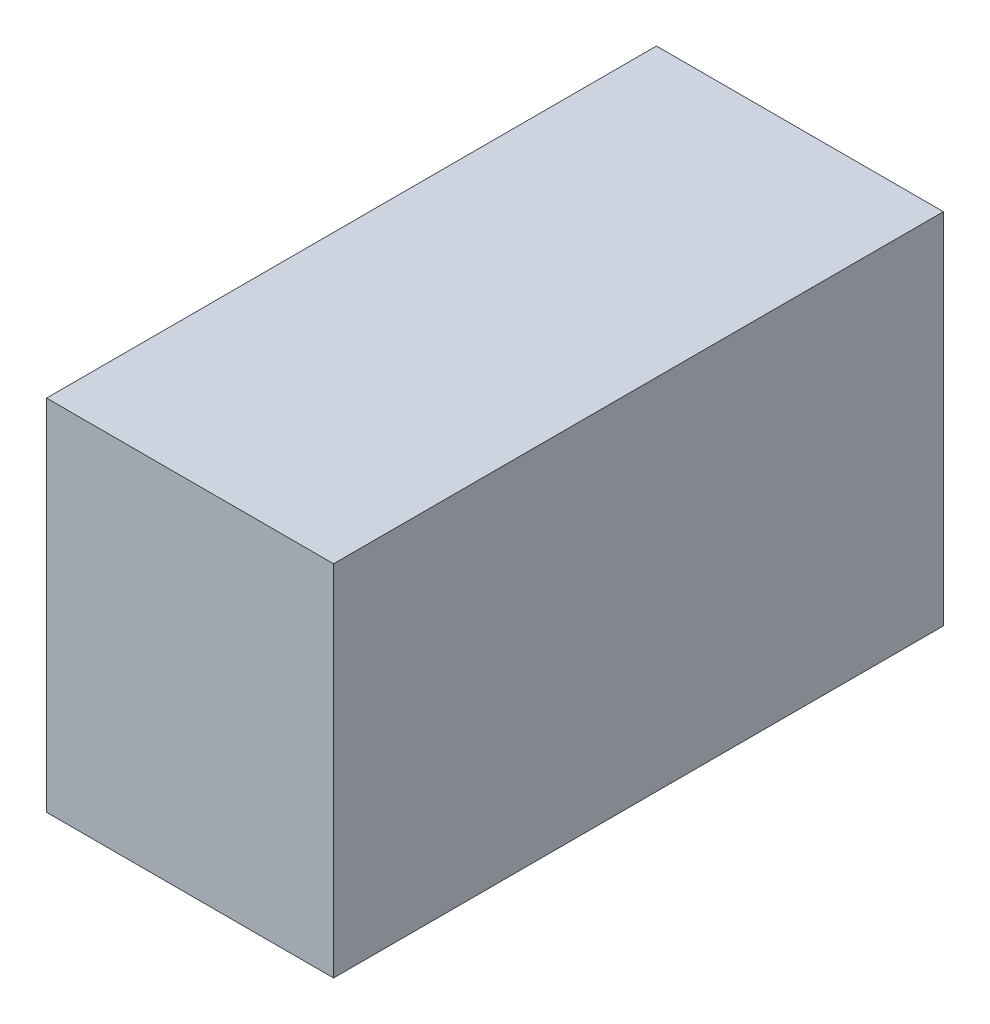
ISO-10303-21;
HEADER;
FILE_DESCRIPTION(('STEP AP214'),'2;1');
FILE_NAME('part.step','',(''),(''),'','','');
FILE_SCHEMA(('AUTOMOTIVE_DESIGN { 1 0 10303 214 1 1 1 1 }'));
ENDSEC;
DATA;
#1=APPLICATION_CONTEXT('core data for automotive mechanical design processes');
#2=APPLICATION_PROTOCOL_DEFINITION('international standard','automotive_design',2000,#1);
#3=PRODUCT_CONTEXT('',#1,'mechanical');
#4=PRODUCT('Part','Part','',(#3));
#5=PRODUCT_RELATED_PRODUCT_CATEGORY('part','',(#4));
#6=PRODUCT_DEFINITION_FORMATION('','',#4);
#7=PRODUCT_DEFINITION_CONTEXT('part definition',#1,'design');
#8=PRODUCT_DEFINITION('design','',#6,#7);
#9=PRODUCT_DEFINITION_SHAPE('','',#8);
#10=(LENGTH_UNIT() NAMED_UNIT(*) SI_UNIT(.MILLI.,.METRE.));
#11=(NAMED_UNIT(*) PLANE_ANGLE_UNIT() SI_UNIT($,.RADIAN.));
#12=(NAMED_UNIT(*) SI_UNIT($,.STERADIAN.) SOLID_ANGLE_UNIT());
#13=UNCERTAINTY_MEASURE_WITH_UNIT(LENGTH_MEASURE(1.E-05),#10,'distance_accuracy_value','');
#14=(GEOMETRIC_REPRESENTATION_CONTEXT(3) GLOBAL_UNCERTAINTY_ASSIGNED_CONTEXT((#13)) GLOBAL_UNIT_ASSIGNED_CONTEXT((#10,
#11,#12)) REPRESENTATION_CONTEXT('',''));
#15=CARTESIAN_POINT('',(0.,0.,0.));
#16=DIRECTION('',(0.,0.,1.));
#17=DIRECTION('',(1.,0.,0.));
#18=AXIS2_PLACEMENT_3D('',#15,#16,#17);
#19=CARTESIAN_POINT('',(-12.446,-15.621,26.7335));
#20=DIRECTION('',(1.,0.,0.));
#21=DIRECTION('',(0.,0.,-1.));
#22=AXIS2_PLACEMENT_3D('',#19,#20,#21);
#23=PLANE('',#22);
#24=DIRECTION('',(0.,0.,-1.));
#25=VECTOR('',#24,1.);
#26=CARTESIAN_POINT('',(-12.446,-15.621,26.7335));
#27=LINE('',#26,#25);
#28=CARTESIAN_POINT('',(-12.446,-15.621,20.3835));
#29=VERTEX_POINT('',#28);
#30=CARTESIAN_POINT('',(-12.446,-15.621,-20.3835));
#31=VERTEX_POINT('',#30);
#32=EDGE_CURVE('E163',#29,#31,#27,.T.);
#33=ORIENTED_EDGE('',*,*,#32,.F.);
#34=DIRECTION('',(0.,1.,0.));
#35=VECTOR('',#34,1.);
#36=CARTESIAN_POINT('',(-12.446,-15.621,20.3835));
#37=LINE('',#36,#35);
#38=CARTESIAN_POINT('',(-12.446,15.621,20.3835));
#39=VERTEX_POINT('',#38);
#40=EDGE_CURVE('E174',#29,#39,#37,.T.);
#41=ORIENTED_EDGE('',*,*,#40,.T.);
#42=DIRECTION('',(0.,0.,-1.));
#43=VECTOR('',#42,1.);
#44=CARTESIAN_POINT('',(-12.446,15.621,26.7335));
#45=LINE('',#44,#43);
#46=CARTESIAN_POINT('',(-12.446,15.621,-20.3835));
#47=VERTEX_POINT('',#46);
#48=EDGE_CURVE('E166',#39,#47,#45,.T.);
#49=ORIENTED_EDGE('',*,*,#48,.T.);
#50=DIRECTION('',(0.,-1.,0.));
#51=VECTOR('',#50,1.);
#52=CARTESIAN_POINT('',(-12.446,-14.0335,-20.3835));
#53=LINE('',#52,#51);
#54=EDGE_CURVE('E200',#47,#31,#53,.T.);
#55=ORIENTED_EDGE('',*,*,#54,.T.);
#56=EDGE_LOOP('',(#33,#41,#49,#55));
#57=FACE_BOUND('',#56,.T.);
#58=ADVANCED_FACE('F45',(#57),#23,.F.);
#59=CARTESIAN_POINT('',(0.,0.,26.7335));
#60=DIRECTION('',(0.,0.,-1.));
#61=DIRECTION('',(-1.,0.,0.));
#62=AXIS2_PLACEMENT_3D('',#59,#60,#61);
#63=PLANE('',#62);
#64=DIRECTION('',(0.,1.,0.));
#65=VECTOR('',#64,1.);
#66=CARTESIAN_POINT('',(-8.54728901240961,-15.621,26.7335));
#67=LINE('',#66,#65);
#68=CARTESIAN_POINT('',(-8.54728901240961,-11.7222890124097,26.7335));
#69=VERTEX_POINT('',#68);
#70=CARTESIAN_POINT('',(-8.54728901240961,11.7222890124097,26.7335));
#71=VERTEX_POINT('',#70);
#72=EDGE_CURVE('E136',#69,#71,#67,.T.);
#73=ORIENTED_EDGE('',*,*,#72,.F.);
#74=DIRECTION('',(1.,0.,0.));
#75=VECTOR('',#74,1.);
#76=CARTESIAN_POINT('',(-12.446,-11.7222890124097,26.7335));
#77=LINE('',#76,#75);
#78=CARTESIAN_POINT('',(8.54728901240961,-11.7222890124097,26.7335));
#79=VERTEX_POINT('',#78);
#80=EDGE_CURVE('E158',#69,#79,#77,.T.);
#81=ORIENTED_EDGE('',*,*,#80,.T.);
#82=DIRECTION('',(0.,1.,0.));
#83=VECTOR('',#82,1.);
#84=CARTESIAN_POINT('',(8.54728901240961,-15.621,26.7335));
#85=LINE('',#84,#83);
#86=CARTESIAN_POINT('',(8.54728901240961,11.7222890124097,26.7335));
#87=VERTEX_POINT('',#86);
#88=EDGE_CURVE('E444',#79,#87,#85,.T.);
#89=ORIENTED_EDGE('',*,*,#88,.T.);
#90=DIRECTION('',(-1.,0.,0.));
#91=VECTOR('',#90,1.);
#92=CARTESIAN_POINT('',(0.,11.7222890124097,26.7335));
#93=LINE('',#92,#91);
#94=EDGE_CURVE('E172',#87,#71,#93,.T.);
#95=ORIENTED_EDGE('',*,*,#94,.T.);
#96=EDGE_LOOP('',(#73,#81,#89,#95));
#97=FACE_BOUND('',#96,.T.);
#98=ADVANCED_FACE('F238',(#97),#63,.F.);
#99=CARTESIAN_POINT('',(-12.7,11.7222890124097,26.7335));
#100=DIRECTION('',(0.,-0.93969262078591,-0.342020143325663));
#101=DIRECTION('',(0.,0.342020143325663,-0.93969262078591));
#102=AXIS2_PLACEMENT_3D('',#99,#100,#101);
#103=PLANE('',#102);
#104=DIRECTION('',(-0.323615577118186,0.323615577118179,-0.88912649071599));
#105=VECTOR('',#104,1.);
#106=CARTESIAN_POINT('',(-8.98219014939736,12.1571901493974,25.538618946431));
#107=LINE('',#106,#105);
#108=CARTESIAN_POINT('',(-10.8585,14.0335,20.3835));
#109=VERTEX_POINT('',#108);
#110=EDGE_CURVE('E133',#71,#109,#107,.T.);
#111=ORIENTED_EDGE('',*,*,#110,.F.);
#112=ORIENTED_EDGE('',*,*,#94,.F.);
#113=DIRECTION('',(0.323615577118186,0.323615577118179,-0.88912649071599));
#114=VECTOR('',#113,1.);
#115=CARTESIAN_POINT('',(6.32212328885753,9.49712328885762,32.8470925800037));
#116=LINE('',#115,#114);
#117=CARTESIAN_POINT('',(10.8585,14.0335,20.3835));
#118=VERTEX_POINT('',#117);
#119=EDGE_CURVE('E151',#87,#118,#116,.T.);
#120=ORIENTED_EDGE('',*,*,#119,.T.);
#121=DIRECTION('',(1.,0.,0.));
#122=VECTOR('',#121,1.);
#123=CARTESIAN_POINT('',(-12.7,14.0335,20.3835));
#124=LINE('',#123,#122);
#125=EDGE_CURVE('E146',#109,#118,#124,.T.);
#126=ORIENTED_EDGE('',*,*,#125,.F.);
#127=EDGE_LOOP('',(#111,#112,#120,#126));
#128=FACE_BOUND('',#127,.T.);
#129=ADVANCED_FACE('F150',(#128),#103,.F.);
#130=CARTESIAN_POINT('',(-12.446,-11.7222890124097,26.7335));
#131=DIRECTION('',(0.,-0.93969262078591,0.342020143325663));
#132=DIRECTION('',(0.,-0.342020143325663,-0.939692620785911));
#133=AXIS2_PLACEMENT_3D('',#130,#131,#132);
#134=PLANE('',#133);
#135=ORIENTED_EDGE('',*,*,#80,.F.);
#136=DIRECTION('',(-0.323615577118186,-0.323615577118179,-0.88912649071599));
#137=VECTOR('',#136,1.);
#138=CARTESIAN_POINT('',(-8.95558948079196,-12.130589480792,25.6117036827667));
#139=LINE('',#138,#137);
#140=CARTESIAN_POINT('',(-10.8585,-14.0335,20.3835));
#141=VERTEX_POINT('',#140);
#142=EDGE_CURVE('E12',#69,#141,#139,.T.);
#143=ORIENTED_EDGE('',*,*,#142,.T.);
#144=DIRECTION('',(1.,0.,0.));
#145=VECTOR('',#144,1.);
#146=CARTESIAN_POINT('',(-12.446,-14.0335,20.3835));
#147=LINE('',#146,#145);
#148=CARTESIAN_POINT('',(10.8585,-14.0335,20.3835));
#149=VERTEX_POINT('',#148);
#150=EDGE_CURVE('E67',#141,#149,#147,.T.);
#151=ORIENTED_EDGE('',*,*,#150,.T.);
#152=DIRECTION('',(0.323615577118186,-0.323615577118179,-0.88912649071599));
#153=VECTOR('',#152,1.);
#154=CARTESIAN_POINT('',(6.34872395746293,-9.52372395746301,32.774007843668));
#155=LINE('',#154,#153);
#156=EDGE_CURVE('E447',#79,#149,#155,.T.);
#157=ORIENTED_EDGE('',*,*,#156,.F.);
#158=EDGE_LOOP('',(#135,#143,#151,#157));
#159=FACE_BOUND('',#158,.T.);
#160=ADVANCED_FACE('F267',(#159),#134,.T.);
#161=CARTESIAN_POINT('',(12.446,-15.621,26.7335));
#162=DIRECTION('',(-1.,0.,0.));
#163=DIRECTION('',(0.,0.,1.));
#164=AXIS2_PLACEMENT_3D('',#161,#162,#163);
#165=PLANE('',#164);
#166=DIRECTION('',(0.,1.,0.));
#167=VECTOR('',#166,1.);
#168=CARTESIAN_POINT('',(12.446,14.0335,20.3835));
#169=LINE('',#168,#167);
#170=CARTESIAN_POINT('',(12.446,-15.621,20.3835));
#171=VERTEX_POINT('',#170);
#172=CARTESIAN_POINT('',(12.446,15.621,20.3835));
#173=VERTEX_POINT('',#172);
#174=EDGE_CURVE('E153',#171,#173,#169,.T.);
#175=ORIENTED_EDGE('',*,*,#174,.F.);
#176=DIRECTION('',(0.,0.,-1.));
#177=VECTOR('',#176,1.);
#178=CARTESIAN_POINT('',(12.446,-15.621,26.7335));
#179=LINE('',#178,#177);
#180=CARTESIAN_POINT('',(12.446,-15.621,-20.3835));
#181=VERTEX_POINT('',#180);
#182=EDGE_CURVE('E155',#171,#181,#179,.T.);
#183=ORIENTED_EDGE('',*,*,#182,.T.);
#184=DIRECTION('',(0.,-1.,0.));
#185=VECTOR('',#184,1.);
#186=CARTESIAN_POINT('',(12.446,-14.0335,-20.3835));
#187=LINE('',#186,#185);
#188=CARTESIAN_POINT('',(12.446,15.621,-20.3835));
#189=VERTEX_POINT('',#188);
#190=EDGE_CURVE('E197',#189,#181,#187,.T.);
#191=ORIENTED_EDGE('',*,*,#190,.F.);
#192=DIRECTION('',(0.,0.,-1.));
#193=VECTOR('',#192,1.);
#194=CARTESIAN_POINT('',(12.446,15.621,26.7335));
#195=LINE('',#194,#193);
#196=EDGE_CURVE('E169',#173,#189,#195,.T.);
#197=ORIENTED_EDGE('',*,*,#196,.F.);
#198=EDGE_LOOP('',(#175,#183,#191,#197));
#199=FACE_BOUND('',#198,.T.);
#200=ADVANCED_FACE('F47',(#199),#165,.F.);
#201=CARTESIAN_POINT('',(0.,0.,-26.7335));
#202=DIRECTION('',(0.,0.,-1.));
#203=DIRECTION('',(-1.,0.,0.));
#204=AXIS2_PLACEMENT_3D('',#201,#202,#203);
#205=PLANE('',#204);
#206=DIRECTION('',(1.,0.,0.));
#207=VECTOR('',#206,1.);
#208=CARTESIAN_POINT('',(-12.446,11.7222890124097,-26.7335));
#209=LINE('',#208,#207);
#210=CARTESIAN_POINT('',(-8.54728901240961,11.7222890124097,-26.7335));
#211=VERTEX_POINT('',#210);
#212=CARTESIAN_POINT('',(8.54728901240961,11.7222890124097,-26.7335));
#213=VERTEX_POINT('',#212);
#214=EDGE_CURVE('E184',#211,#213,#209,.T.);
#215=ORIENTED_EDGE('',*,*,#214,.T.);
#216=DIRECTION('',(0.,1.,0.));
#217=VECTOR('',#216,1.);
#218=CARTESIAN_POINT('',(8.54728901240961,-15.621,-26.7335));
#219=LINE('',#218,#217);
#220=CARTESIAN_POINT('',(8.54728901240961,-11.7222890124097,-26.7335));
#221=VERTEX_POINT('',#220);
#222=EDGE_CURVE('E194',#221,#213,#219,.T.);
#223=ORIENTED_EDGE('',*,*,#222,.F.);
#224=DIRECTION('',(1.,0.,0.));
#225=VECTOR('',#224,1.);
#226=CARTESIAN_POINT('',(-12.446,-11.7222890124097,-26.7335));
#227=LINE('',#226,#225);
#228=CARTESIAN_POINT('',(-8.54728901240961,-11.7222890124097,-26.7335));
#229=VERTEX_POINT('',#228);
#230=EDGE_CURVE('E210',#229,#221,#227,.T.);
#231=ORIENTED_EDGE('',*,*,#230,.F.);
#232=DIRECTION('',(0.,1.,0.));
#233=VECTOR('',#232,1.);
#234=CARTESIAN_POINT('',(-8.54728901240961,-15.875,-26.7335));
#235=LINE('',#234,#233);
#236=EDGE_CURVE('E196',#229,#211,#235,.T.);
#237=ORIENTED_EDGE('',*,*,#236,.T.);
#238=EDGE_LOOP('',(#215,#223,#231,#237));
#239=FACE_BOUND('',#238,.T.);
#240=ADVANCED_FACE('F192',(#239),#205,.T.);
#241=CARTESIAN_POINT('',(-12.446,-11.7222890124097,-26.7335));
#242=DIRECTION('',(0.,0.93969262078591,0.342020143325663));
#243=DIRECTION('',(0.,-0.342020143325663,0.939692620785911));
#244=AXIS2_PLACEMENT_3D('',#241,#242,#243);
#245=PLANE('',#244);
#246=DIRECTION('',(-0.323615577118186,0.323615577118179,-0.88912649071599));
#247=VECTOR('',#246,1.);
#248=CARTESIAN_POINT('',(6.34872395746293,-9.52372395746301,-32.774007843668));
#249=LINE('',#248,#247);
#250=CARTESIAN_POINT('',(10.8585,-14.0335,-20.3835));
#251=VERTEX_POINT('',#250);
#252=EDGE_CURVE('E454',#251,#221,#249,.T.);
#253=ORIENTED_EDGE('',*,*,#252,.F.);
#254=DIRECTION('',(1.,0.,0.));
#255=VECTOR('',#254,1.);
#256=CARTESIAN_POINT('',(-12.446,-14.0335,-20.3835));
#257=LINE('',#256,#255);
#258=CARTESIAN_POINT('',(-10.8585,-14.0335,-20.3835));
#259=VERTEX_POINT('',#258);
#260=EDGE_CURVE('E215',#259,#251,#257,.T.);
#261=ORIENTED_EDGE('',*,*,#260,.F.);
#262=DIRECTION('',(0.323615577118186,0.323615577118179,-0.88912649071599));
#263=VECTOR('',#262,1.);
#264=CARTESIAN_POINT('',(-8.95558948079196,-12.130589480792,-25.6117036827667));
#265=LINE('',#264,#263);
#266=EDGE_CURVE('E205',#259,#229,#265,.T.);
#267=ORIENTED_EDGE('',*,*,#266,.T.);
#268=ORIENTED_EDGE('',*,*,#230,.T.);
#269=EDGE_LOOP('',(#253,#261,#267,#268));
#270=FACE_BOUND('',#269,.T.);
#271=ADVANCED_FACE('F253',(#270),#245,.F.);
#272=CARTESIAN_POINT('',(-12.446,11.7222890124097,-26.7335));
#273=DIRECTION('',(0.,0.93969262078591,-0.342020143325663));
#274=DIRECTION('',(0.,0.342020143325663,0.939692620785911));
#275=AXIS2_PLACEMENT_3D('',#272,#273,#274);
#276=PLANE('',#275);
#277=DIRECTION('',(1.,0.,0.));
#278=VECTOR('',#277,1.);
#279=CARTESIAN_POINT('',(-12.446,14.0335,-20.3835));
#280=LINE('',#279,#278);
#281=CARTESIAN_POINT('',(-10.8585,14.0335,-20.3835));
#282=VERTEX_POINT('',#281);
#283=CARTESIAN_POINT('',(10.8585,14.0335,-20.3835));
#284=VERTEX_POINT('',#283);
#285=EDGE_CURVE('E186',#282,#284,#280,.T.);
#286=ORIENTED_EDGE('',*,*,#285,.T.);
#287=DIRECTION('',(-0.323615577118186,-0.323615577118179,-0.88912649071599));
#288=VECTOR('',#287,1.);
#289=CARTESIAN_POINT('',(6.34872395746293,9.52372395746301,-32.774007843668));
#290=LINE('',#289,#288);
#291=EDGE_CURVE('E54',#284,#213,#290,.T.);
#292=ORIENTED_EDGE('',*,*,#291,.T.);
#293=ORIENTED_EDGE('',*,*,#214,.F.);
#294=DIRECTION('',(0.323615577118186,-0.323615577118179,-0.88912649071599));
#295=VECTOR('',#294,1.);
#296=CARTESIAN_POINT('',(-8.95558948079196,12.130589480792,-25.6117036827667));
#297=LINE('',#296,#295);
#298=EDGE_CURVE('E459',#282,#211,#297,.T.);
#299=ORIENTED_EDGE('',*,*,#298,.F.);
#300=EDGE_LOOP('',(#286,#292,#293,#299));
#301=FACE_BOUND('',#300,.T.);
#302=ADVANCED_FACE('F182',(#301),#276,.T.);
#303=CARTESIAN_POINT('',(-12.446,15.621,26.7335));
#304=DIRECTION('',(0.,-1.,0.));
#305=DIRECTION('',(0.,0.,-1.));
#306=AXIS2_PLACEMENT_3D('',#303,#304,#305);
#307=PLANE('',#306);
#308=DIRECTION('',(1.,0.,0.));
#309=VECTOR('',#308,1.);
#310=CARTESIAN_POINT('',(-12.446,15.621,-20.3835));
#311=LINE('',#310,#309);
#312=EDGE_CURVE('E202',#47,#189,#311,.T.);
#313=ORIENTED_EDGE('',*,*,#312,.F.);
#314=ORIENTED_EDGE('',*,*,#48,.F.);
#315=DIRECTION('',(1.,0.,0.));
#316=VECTOR('',#315,1.);
#317=CARTESIAN_POINT('',(-12.7,15.621,20.3835));
#318=LINE('',#317,#316);
#319=EDGE_CURVE('E152',#39,#173,#318,.T.);
#320=ORIENTED_EDGE('',*,*,#319,.T.);
#321=ORIENTED_EDGE('',*,*,#196,.T.);
#322=EDGE_LOOP('',(#313,#314,#320,#321));
#323=FACE_BOUND('',#322,.T.);
#324=ADVANCED_FACE('F234',(#323),#307,.F.);
#325=CARTESIAN_POINT('',(-12.446,-15.621,26.7335));
#326=DIRECTION('',(0.,1.,0.));
#327=DIRECTION('',(0.,0.,1.));
#328=AXIS2_PLACEMENT_3D('',#325,#326,#327);
#329=PLANE('',#328);
#330=CARTESIAN_POINT('',(0.,-15.621,0.));
#331=DIRECTION('',(0.,-1.,0.));
#332=DIRECTION('',(0.,0.,-1.));
#333=AXIS2_PLACEMENT_3D('',#330,#331,#332);
#334=CIRCLE('',#333,7.34187);
#335=CARTESIAN_POINT('',(0.,-15.621,-7.34187));
#336=VERTEX_POINT('',#335);
#337=EDGE_CURVE('E432',#336,#336,#334,.T.);
#338=ORIENTED_EDGE('',*,*,#337,.F.);
#339=EDGE_LOOP('',(#338));
#340=FACE_BOUND('',#339,.T.);
#341=ORIENTED_EDGE('',*,*,#32,.T.);
#342=DIRECTION('',(1.,0.,0.));
#343=VECTOR('',#342,1.);
#344=CARTESIAN_POINT('',(-12.446,-15.621,-20.3835));
#345=LINE('',#344,#343);
#346=EDGE_CURVE('E212',#31,#181,#345,.T.);
#347=ORIENTED_EDGE('',*,*,#346,.T.);
#348=ORIENTED_EDGE('',*,*,#182,.F.);
#349=DIRECTION('',(1.,0.,0.));
#350=VECTOR('',#349,1.);
#351=CARTESIAN_POINT('',(-12.446,-15.621,20.3835));
#352=LINE('',#351,#350);
#353=EDGE_CURVE('E214',#29,#171,#352,.T.);
#354=ORIENTED_EDGE('',*,*,#353,.F.);
#355=EDGE_LOOP('',(#341,#347,#348,#354));
#356=FACE_BOUND('',#355,.T.);
#357=ADVANCED_FACE('F229',(#340,#356),#329,.F.);
#358=CARTESIAN_POINT('',(-12.7,14.0335,20.3835));
#359=DIRECTION('',(0.,0.,-1.));
#360=DIRECTION('',(-1.,0.,0.));
#361=AXIS2_PLACEMENT_3D('',#358,#359,#360);
#362=PLANE('',#361);
#363=ORIENTED_EDGE('',*,*,#150,.F.);
#364=DIRECTION('',(0.,1.,0.));
#365=VECTOR('',#364,1.);
#366=CARTESIAN_POINT('',(-10.8585,-15.621,20.3835));
#367=LINE('',#366,#365);
#368=EDGE_CURVE('E61',#141,#109,#367,.T.);
#369=ORIENTED_EDGE('',*,*,#368,.T.);
#370=ORIENTED_EDGE('',*,*,#125,.T.);
#371=DIRECTION('',(0.,1.,0.));
#372=VECTOR('',#371,1.);
#373=CARTESIAN_POINT('',(10.8585,-15.621,20.3835));
#374=LINE('',#373,#372);
#375=EDGE_CURVE('E141',#149,#118,#374,.T.);
#376=ORIENTED_EDGE('',*,*,#375,.F.);
#377=EDGE_LOOP('',(#363,#369,#370,#376));
#378=FACE_BOUND('',#377,.T.);
#379=ORIENTED_EDGE('',*,*,#40,.F.);
#380=ORIENTED_EDGE('',*,*,#353,.T.);
#381=ORIENTED_EDGE('',*,*,#174,.T.);
#382=ORIENTED_EDGE('',*,*,#319,.F.);
#383=EDGE_LOOP('',(#379,#380,#381,#382));
#384=FACE_BOUND('',#383,.T.);
#385=ADVANCED_FACE('F144',(#378,#384),#362,.F.);
#386=CARTESIAN_POINT('',(-12.446,-14.0335,-20.3835));
#387=DIRECTION('',(0.,0.,1.));
#388=DIRECTION('',(1.,0.,0.));
#389=AXIS2_PLACEMENT_3D('',#386,#387,#388);
#390=PLANE('',#389);
#391=ORIENTED_EDGE('',*,*,#260,.T.);
#392=DIRECTION('',(0.,1.,0.));
#393=VECTOR('',#392,1.);
#394=CARTESIAN_POINT('',(10.8585,-15.621,-20.3835));
#395=LINE('',#394,#393);
#396=EDGE_CURVE('E452',#251,#284,#395,.T.);
#397=ORIENTED_EDGE('',*,*,#396,.T.);
#398=ORIENTED_EDGE('',*,*,#285,.F.);
#399=DIRECTION('',(0.,1.,0.));
#400=VECTOR('',#399,1.);
#401=CARTESIAN_POINT('',(-10.8585,-15.875,-20.3835));
#402=LINE('',#401,#400);
#403=EDGE_CURVE('E457',#259,#282,#402,.T.);
#404=ORIENTED_EDGE('',*,*,#403,.F.);
#405=EDGE_LOOP('',(#391,#397,#398,#404));
#406=FACE_BOUND('',#405,.T.);
#407=ORIENTED_EDGE('',*,*,#312,.T.);
#408=ORIENTED_EDGE('',*,*,#190,.T.);
#409=ORIENTED_EDGE('',*,*,#346,.F.);
#410=ORIENTED_EDGE('',*,*,#54,.F.);
#411=EDGE_LOOP('',(#407,#408,#409,#410));
#412=FACE_BOUND('',#411,.T.);
#413=ADVANCED_FACE('F231',(#406,#412),#390,.F.);
#414=CARTESIAN_POINT('',(-10.8585,-15.875,-20.3835));
#415=DIRECTION('',(0.939692620785908,0.,0.34202014332567));
#416=DIRECTION('',(0.34202014332567,0.,-0.939692620785908));
#417=AXIS2_PLACEMENT_3D('',#414,#415,#416);
#418=PLANE('',#417);
#419=ORIENTED_EDGE('',*,*,#403,.T.);
#420=ORIENTED_EDGE('',*,*,#298,.T.);
#421=ORIENTED_EDGE('',*,*,#236,.F.);
#422=ORIENTED_EDGE('',*,*,#266,.F.);
#423=EDGE_LOOP('',(#419,#420,#421,#422));
#424=FACE_BOUND('',#423,.T.);
#425=ADVANCED_FACE('F262',(#424),#418,.F.);
#426=CARTESIAN_POINT('',(10.8585,-15.621,-20.3835));
#427=DIRECTION('',(0.939692620785908,0.,-0.342020143325669));
#428=DIRECTION('',(-0.342020143325669,0.,-0.939692620785908));
#429=AXIS2_PLACEMENT_3D('',#426,#427,#428);
#430=PLANE('',#429);
#431=ORIENTED_EDGE('',*,*,#252,.T.);
#432=ORIENTED_EDGE('',*,*,#222,.T.);
#433=ORIENTED_EDGE('',*,*,#291,.F.);
#434=ORIENTED_EDGE('',*,*,#396,.F.);
#435=EDGE_LOOP('',(#431,#432,#433,#434));
#436=FACE_BOUND('',#435,.T.);
#437=ADVANCED_FACE('F301',(#436),#430,.T.);
#438=CARTESIAN_POINT('',(10.8585,-15.621,20.3835));
#439=DIRECTION('',(-0.939692620785908,0.,-0.342020143325669));
#440=DIRECTION('',(-0.342020143325669,0.,0.939692620785908));
#441=AXIS2_PLACEMENT_3D('',#438,#439,#440);
#442=PLANE('',#441);
#443=ORIENTED_EDGE('',*,*,#88,.F.);
#444=ORIENTED_EDGE('',*,*,#156,.T.);
#445=ORIENTED_EDGE('',*,*,#375,.T.);
#446=ORIENTED_EDGE('',*,*,#119,.F.);
#447=EDGE_LOOP('',(#443,#444,#445,#446));
#448=FACE_BOUND('',#447,.T.);
#449=ADVANCED_FACE('F306',(#448),#442,.F.);
#450=CARTESIAN_POINT('',(-10.8585,-15.621,20.3835));
#451=DIRECTION('',(-0.939692620785908,0.,0.342020143325669));
#452=DIRECTION('',(0.342020143325669,0.,0.939692620785908));
#453=AXIS2_PLACEMENT_3D('',#450,#451,#452);
#454=PLANE('',#453);
#455=ORIENTED_EDGE('',*,*,#110,.T.);
#456=ORIENTED_EDGE('',*,*,#368,.F.);
#457=ORIENTED_EDGE('',*,*,#142,.F.);
#458=ORIENTED_EDGE('',*,*,#72,.T.);
#459=EDGE_LOOP('',(#455,#456,#457,#458));
#460=FACE_BOUND('',#459,.T.);
#461=ADVANCED_FACE('F134',(#460),#454,.T.);
#462=CARTESIAN_POINT('',(0.,-9.52499999999999,0.));
#463=DIRECTION('',(0.,1.,0.));
#464=DIRECTION('',(1.,0.,0.));
#465=AXIS2_PLACEMENT_3D('',#462,#463,#464);
#466=PLANE('',#465);
#467=CARTESIAN_POINT('',(0.,-9.52499999999999,0.));
#468=DIRECTION('',(0.,1.,0.));
#469=DIRECTION('',(0.,0.,1.));
#470=AXIS2_PLACEMENT_3D('',#467,#468,#469);
#471=CIRCLE('',#470,7.34187);
#472=CARTESIAN_POINT('',(0.,-9.52499999999999,-7.34187));
#473=VERTEX_POINT('',#472);
#474=EDGE_CURVE('E435',#473,#473,#471,.F.);
#475=ORIENTED_EDGE('',*,*,#474,.T.);
#476=EDGE_LOOP('',(#475));
#477=FACE_BOUND('',#476,.T.);
#478=CARTESIAN_POINT('',(0.,-9.52499999999999,0.));
#479=DIRECTION('',(0.,1.,0.));
#480=DIRECTION('',(0.,0.,1.));
#481=AXIS2_PLACEMENT_3D('',#478,#479,#480);
#482=CIRCLE('',#481,5.75437);
#483=CARTESIAN_POINT('',(0.,-9.52499999999999,5.75437));
#484=VERTEX_POINT('',#483);
#485=EDGE_CURVE('E49',#484,#484,#482,.F.);
#486=ORIENTED_EDGE('',*,*,#485,.F.);
#487=EDGE_LOOP('',(#486));
#488=FACE_BOUND('',#487,.T.);
#489=ADVANCED_FACE('F388',(#477,#488),#466,.F.);
#490=CARTESIAN_POINT('',(0.,11.2409442543603,0.));
#491=DIRECTION('',(0.,-1.,0.));
#492=DIRECTION('',(0.,0.,-1.));
#493=AXIS2_PLACEMENT_3D('',#490,#491,#492);
#494=CYLINDRICAL_SURFACE('',#493,7.34187);
#495=CARTESIAN_POINT('',(0.,-15.621,-7.34187));
#496=CARTESIAN_POINT('',(0.,-15.5575,-7.34187));
#497=CARTESIAN_POINT('',(0.,-15.494,-7.34187));
#498=CARTESIAN_POINT('',(0.,-15.367,-7.34187));
#499=CARTESIAN_POINT('',(0.,-15.3035,-7.34187));
#500=CARTESIAN_POINT('',(0.,-15.1765,-7.34187));
#501=CARTESIAN_POINT('',(0.,-15.113,-7.34187));
#502=CARTESIAN_POINT('',(0.,-14.986,-7.34187));
#503=CARTESIAN_POINT('',(0.,-14.9225,-7.34187));
#504=CARTESIAN_POINT('',(0.,-14.7955,-7.34187));
#505=CARTESIAN_POINT('',(0.,-14.732,-7.34187));
#506=CARTESIAN_POINT('',(0.,-14.605,-7.34187));
#507=CARTESIAN_POINT('',(0.,-14.5415,-7.34187));
#508=CARTESIAN_POINT('',(0.,-14.4145,-7.34187));
#509=CARTESIAN_POINT('',(0.,-14.351,-7.34187));
#510=CARTESIAN_POINT('',(0.,-14.224,-7.34187));
#511=CARTESIAN_POINT('',(0.,-14.1605,-7.34187));
#512=CARTESIAN_POINT('',(0.,-14.0335,-7.34187));
#513=CARTESIAN_POINT('',(0.,-13.97,-7.34187));
#514=CARTESIAN_POINT('',(0.,-13.843,-7.34187));
#515=CARTESIAN_POINT('',(0.,-13.7795,-7.34187));
#516=CARTESIAN_POINT('',(0.,-13.6525,-7.34187));
#517=CARTESIAN_POINT('',(0.,-13.589,-7.34187));
#518=CARTESIAN_POINT('',(0.,-13.462,-7.34187));
#519=CARTESIAN_POINT('',(0.,-13.3985,-7.34187));
#520=CARTESIAN_POINT('',(0.,-13.2715,-7.34187));
#521=CARTESIAN_POINT('',(0.,-13.208,-7.34187));
#522=CARTESIAN_POINT('',(0.,-13.081,-7.34187));
#523=CARTESIAN_POINT('',(0.,-13.0175,-7.34187));
#524=CARTESIAN_POINT('',(0.,-12.8905,-7.34187));
#525=CARTESIAN_POINT('',(0.,-12.827,-7.34187));
#526=CARTESIAN_POINT('',(0.,-12.7,-7.34187));
#527=CARTESIAN_POINT('',(0.,-12.6365,-7.34187));
#528=CARTESIAN_POINT('',(0.,-12.5095,-7.34187));
#529=CARTESIAN_POINT('',(0.,-12.446,-7.34187));
#530=CARTESIAN_POINT('',(0.,-12.319,-7.34187));
#531=CARTESIAN_POINT('',(0.,-12.2555,-7.34187));
#532=CARTESIAN_POINT('',(0.,-12.1285,-7.34187));
#533=CARTESIAN_POINT('',(0.,-12.065,-7.34187));
#534=CARTESIAN_POINT('',(0.,-11.938,-7.34187));
#535=CARTESIAN_POINT('',(0.,-11.8745,-7.34187));
#536=CARTESIAN_POINT('',(0.,-11.7475,-7.34187));
#537=CARTESIAN_POINT('',(0.,-11.684,-7.34187));
#538=CARTESIAN_POINT('',(0.,-11.557,-7.34187));
#539=CARTESIAN_POINT('',(0.,-11.4935,-7.34187));
#540=CARTESIAN_POINT('',(0.,-11.3665,-7.34187));
#541=CARTESIAN_POINT('',(0.,-11.303,-7.34187));
#542=CARTESIAN_POINT('',(0.,-11.176,-7.34187));
#543=CARTESIAN_POINT('',(0.,-11.1125,-7.34187));
#544=CARTESIAN_POINT('',(0.,-10.9855,-7.34187));
#545=CARTESIAN_POINT('',(0.,-10.922,-7.34187));
#546=CARTESIAN_POINT('',(0.,-10.795,-7.34187));
#547=CARTESIAN_POINT('',(0.,-10.7315,-7.34187));
#548=CARTESIAN_POINT('',(0.,-10.6045,-7.34187));
#549=CARTESIAN_POINT('',(0.,-10.541,-7.34187));
#550=CARTESIAN_POINT('',(0.,-10.414,-7.34187));
#551=CARTESIAN_POINT('',(0.,-10.3505,-7.34187));
#552=CARTESIAN_POINT('',(0.,-10.2235,-7.34187));
#553=CARTESIAN_POINT('',(0.,-10.16,-7.34187));
#554=CARTESIAN_POINT('',(0.,-10.033,-7.34187));
#555=CARTESIAN_POINT('',(0.,-9.96949999999999,-7.34187));
#556=CARTESIAN_POINT('',(0.,-9.84249999999999,-7.34187));
#557=CARTESIAN_POINT('',(0.,-9.77899999999999,-7.34187));
#558=CARTESIAN_POINT('',(0.,-9.65199999999999,-7.34187));
#559=CARTESIAN_POINT('',(0.,-9.58849999999999,-7.34187));
#560=CARTESIAN_POINT('',(0.,-9.52499999999999,-7.34187));
#561=B_SPLINE_CURVE_WITH_KNOTS('',3,(#495,#496,#497,#498,#499,#500,#501,#502,#503,#504,#505,
#506,#507,#508,#509,#510,#511,#512,#513,#514,#515,#516,#517,#518,#519,#520,#521,#522,#523,#524,
#525,#526,#527,#528,#529,#530,#531,#532,#533,#534,#535,#536,#537,#538,#539,#540,#541,#542,#543,
#544,#545,#546,#547,#548,#549,#550,#551,#552,#553,#554,#555,#556,#557,#558,#559,#560),
.UNSPECIFIED.,.F.,.F.,(4,2,2,2,2,2,2,2,2,2,2,2,2,2,2,2,2,2,2,2,2,2,2,2,2,2,2,2,2,2,2,2,4),(0.,
0.1905,0.380999999999999,0.571499999999999,0.761999999999999,0.952499999999998,1.143,1.3335,
1.524,1.7145,1.905,2.0955,2.286,2.4765,2.667,2.8575,3.048,3.2385,3.429,3.6195,3.81,4.0005,4.191,
4.3815,4.572,4.7625,4.953,5.1435,5.334,5.5245,5.715,5.9055,6.096),.UNSPECIFIED.);
#562=EDGE_CURVE('BSEAM397',#336,#473,#561,.T.);
#563=ORIENTED_EDGE('',*,*,#337,.T.);
#564=ORIENTED_EDGE('',*,*,#474,.F.);
#565=ORIENTED_EDGE('',*,*,#562,.T.);
#566=ORIENTED_EDGE('',*,*,#562,.F.);
#567=EDGE_LOOP('',(#563,#565,#564,#566));
#568=FACE_BOUND('',#567,.T.);
#569=ADVANCED_FACE('F397',(#568),#494,.F.);
#570=CARTESIAN_POINT('',(0.,-3.175,0.));
#571=DIRECTION('',(0.,1.,0.));
#572=DIRECTION('',(1.,0.,0.));
#573=AXIS2_PLACEMENT_3D('',#570,#571,#572);
#574=PLANE('',#573);
#575=CARTESIAN_POINT('',(0.,-3.175,0.));
#576=DIRECTION('',(0.,1.,0.));
#577=DIRECTION('',(0.,0.,1.));
#578=AXIS2_PLACEMENT_3D('',#575,#576,#577);
#579=CIRCLE('',#578,5.75437);
#580=CARTESIAN_POINT('',(0.,-3.175,5.75437));
#581=VERTEX_POINT('',#580);
#582=EDGE_CURVE('E438',#581,#581,#579,.F.);
#583=ORIENTED_EDGE('',*,*,#582,.T.);
#584=EDGE_LOOP('',(#583));
#585=FACE_BOUND('',#584,.T.);
#586=ADVANCED_FACE('F391',(#585),#574,.F.);
#587=CARTESIAN_POINT('',(0.,13.1008161938257,0.));
#588=DIRECTION('',(0.,-1.,0.));
#589=DIRECTION('',(0.,0.,-1.));
#590=AXIS2_PLACEMENT_3D('',#587,#588,#589);
#591=CYLINDRICAL_SURFACE('',#590,5.75437);
#592=ORIENTED_EDGE('',*,*,#485,.T.);
#593=EDGE_LOOP('',(#592));
#594=FACE_BOUND('',#593,.T.);
#595=ORIENTED_EDGE('',*,*,#582,.F.);
#596=EDGE_LOOP('',(#595));
#597=FACE_BOUND('',#596,.T.);
#598=ADVANCED_FACE('F396',(#594,#597),#591,.F.);
#599=CLOSED_SHELL('',(#58,#98,#129,#160,#200,#240,#271,#302,#324,#357,#385,#413,#425,#437,#449,
#461,#489,#569,#586,#598));
#600=MANIFOLD_SOLID_BREP('B2',#599);
#601=CARTESIAN_POINT('',(12.7,15.875,26.9875));
#602=DIRECTION('',(-1.,0.,0.));
#603=DIRECTION('',(0.,-1.,0.));
#604=AXIS2_PLACEMENT_3D('',#601,#602,#603);
#605=PLANE('',#604);
#606=DIRECTION('',(0.,1.,0.));
#607=VECTOR('',#606,1.);
#608=CARTESIAN_POINT('',(12.7,15.875,-26.9875));
#609=LINE('',#608,#607);
#610=CARTESIAN_POINT('',(12.7,-15.875,-26.9875));
#611=VERTEX_POINT('',#610);
#612=CARTESIAN_POINT('',(12.7,15.875,-26.9875));
#613=VERTEX_POINT('',#612);
#614=EDGE_CURVE('E539',#611,#613,#609,.T.);
#615=ORIENTED_EDGE('',*,*,#614,.T.);
#616=DIRECTION('',(0.,0.,-1.));
#617=VECTOR('',#616,1.);
#618=CARTESIAN_POINT('',(12.7,15.875,26.9875));
#619=LINE('',#618,#617);
#620=CARTESIAN_POINT('',(12.7,15.875,26.9875));
#621=VERTEX_POINT('',#620);
#622=EDGE_CURVE('E43',#621,#613,#619,.T.);
#623=ORIENTED_EDGE('',*,*,#622,.F.);
#624=DIRECTION('',(0.,1.,0.));
#625=VECTOR('',#624,1.);
#626=CARTESIAN_POINT('',(12.7,15.875,26.9875));
#627=LINE('',#626,#625);
#628=CARTESIAN_POINT('',(12.7,-15.875,26.9875));
#629=VERTEX_POINT('',#628);
#630=EDGE_CURVE('E527',#629,#621,#627,.T.);
#631=ORIENTED_EDGE('',*,*,#630,.F.);
#632=DIRECTION('',(0.,0.,-1.));
#633=VECTOR('',#632,1.);
#634=CARTESIAN_POINT('',(12.7,-15.875,26.9875));
#635=LINE('',#634,#633);
#636=EDGE_CURVE('E535',#629,#611,#635,.T.);
#637=ORIENTED_EDGE('',*,*,#636,.T.);
#638=EDGE_LOOP('',(#615,#623,#631,#637));
#639=FACE_BOUND('',#638,.T.);
#640=ADVANCED_FACE('F476',(#639),#605,.F.);
#641=CARTESIAN_POINT('',(-12.7,15.875,26.9875));
#642=DIRECTION('',(0.,-1.,0.));
#643=DIRECTION('',(0.,0.,-1.));
#644=AXIS2_PLACEMENT_3D('',#641,#642,#643);
#645=PLANE('',#644);
#646=DIRECTION('',(-1.,0.,0.));
#647=VECTOR('',#646,1.);
#648=CARTESIAN_POINT('',(-12.7,15.875,-26.9875));
#649=LINE('',#648,#647);
#650=CARTESIAN_POINT('',(-12.7,15.875,-26.9875));
#651=VERTEX_POINT('',#650);
#652=EDGE_CURVE('E531',#613,#651,#649,.T.);
#653=ORIENTED_EDGE('',*,*,#652,.T.);
#654=DIRECTION('',(0.,0.,-1.));
#655=VECTOR('',#654,1.);
#656=CARTESIAN_POINT('',(-12.7,15.875,26.9875));
#657=LINE('',#656,#655);
#658=CARTESIAN_POINT('',(-12.7,15.875,26.9875));
#659=VERTEX_POINT('',#658);
#660=EDGE_CURVE('E484',#659,#651,#657,.T.);
#661=ORIENTED_EDGE('',*,*,#660,.F.);
#662=DIRECTION('',(-1.,0.,0.));
#663=VECTOR('',#662,1.);
#664=CARTESIAN_POINT('',(-12.7,15.875,26.9875));
#665=LINE('',#664,#663);
#666=EDGE_CURVE('E522',#621,#659,#665,.T.);
#667=ORIENTED_EDGE('',*,*,#666,.F.);
#668=ORIENTED_EDGE('',*,*,#622,.T.);
#669=EDGE_LOOP('',(#653,#661,#667,#668));
#670=FACE_BOUND('',#669,.T.);
#671=ADVANCED_FACE('F530',(#670),#645,.F.);
#672=CARTESIAN_POINT('',(-12.7,15.875,26.9875));
#673=DIRECTION('',(1.,0.,0.));
#674=DIRECTION('',(0.,1.,0.));
#675=AXIS2_PLACEMENT_3D('',#672,#673,#674);
#676=PLANE('',#675);
#677=DIRECTION('',(0.,-1.,0.));
#678=VECTOR('',#677,1.);
#679=CARTESIAN_POINT('',(-12.7,15.875,-26.9875));
#680=LINE('',#679,#678);
#681=CARTESIAN_POINT('',(-12.7,-15.875,-26.9875));
#682=VERTEX_POINT('',#681);
#683=EDGE_CURVE('E509',#651,#682,#680,.T.);
#684=ORIENTED_EDGE('',*,*,#683,.T.);
#685=DIRECTION('',(0.,0.,-1.));
#686=VECTOR('',#685,1.);
#687=CARTESIAN_POINT('',(-12.7,-15.875,26.9875));
#688=LINE('',#687,#686);
#689=CARTESIAN_POINT('',(-12.7,-15.875,26.9875));
#690=VERTEX_POINT('',#689);
#691=EDGE_CURVE('E532',#690,#682,#688,.T.);
#692=ORIENTED_EDGE('',*,*,#691,.F.);
#693=DIRECTION('',(0.,-1.,0.));
#694=VECTOR('',#693,1.);
#695=CARTESIAN_POINT('',(-12.7,15.875,26.9875));
#696=LINE('',#695,#694);
#697=EDGE_CURVE('E525',#659,#690,#696,.T.);
#698=ORIENTED_EDGE('',*,*,#697,.F.);
#699=ORIENTED_EDGE('',*,*,#660,.T.);
#700=EDGE_LOOP('',(#684,#692,#698,#699));
#701=FACE_BOUND('',#700,.T.);
#702=ADVANCED_FACE('F533',(#701),#676,.F.);
#703=CARTESIAN_POINT('',(-12.7,-15.875,26.9875));
#704=DIRECTION('',(0.,1.,0.));
#705=DIRECTION('',(0.,0.,1.));
#706=AXIS2_PLACEMENT_3D('',#703,#704,#705);
#707=PLANE('',#706);
#708=DIRECTION('',(1.,0.,0.));
#709=VECTOR('',#708,1.);
#710=CARTESIAN_POINT('',(-12.7,-15.875,-26.9875));
#711=LINE('',#710,#709);
#712=EDGE_CURVE('E515',#682,#611,#711,.T.);
#713=ORIENTED_EDGE('',*,*,#712,.T.);
#714=ORIENTED_EDGE('',*,*,#636,.F.);
#715=DIRECTION('',(1.,0.,0.));
#716=VECTOR('',#715,1.);
#717=CARTESIAN_POINT('',(-12.7,-15.875,26.9875));
#718=LINE('',#717,#716);
#719=EDGE_CURVE('E492',#690,#629,#718,.T.);
#720=ORIENTED_EDGE('',*,*,#719,.F.);
#721=ORIENTED_EDGE('',*,*,#691,.T.);
#722=EDGE_LOOP('',(#713,#714,#720,#721));
#723=FACE_BOUND('',#722,.T.);
#724=ADVANCED_FACE('F546',(#723),#707,.F.);
#725=CARTESIAN_POINT('',(0.,0.,26.9875));
#726=DIRECTION('',(0.,0.,1.));
#727=DIRECTION('',(1.,0.,0.));
#728=AXIS2_PLACEMENT_3D('',#725,#726,#727);
#729=PLANE('',#728);
#730=ORIENTED_EDGE('',*,*,#630,.T.);
#731=ORIENTED_EDGE('',*,*,#666,.T.);
#732=ORIENTED_EDGE('',*,*,#697,.T.);
#733=ORIENTED_EDGE('',*,*,#719,.T.);
#734=EDGE_LOOP('',(#730,#731,#732,#733));
#735=FACE_BOUND('',#734,.T.);
#736=ADVANCED_FACE('F523',(#735),#729,.T.);
#737=CARTESIAN_POINT('',(0.,0.,-26.9875));
#738=DIRECTION('',(0.,0.,1.));
#739=DIRECTION('',(1.,0.,0.));
#740=AXIS2_PLACEMENT_3D('',#737,#738,#739);
#741=PLANE('',#740);
#742=ORIENTED_EDGE('',*,*,#614,.F.);
#743=ORIENTED_EDGE('',*,*,#712,.F.);
#744=ORIENTED_EDGE('',*,*,#683,.F.);
#745=ORIENTED_EDGE('',*,*,#652,.F.);
#746=EDGE_LOOP('',(#742,#743,#744,#745));
#747=FACE_BOUND('',#746,.T.);
#748=ADVANCED_FACE('F549',(#747),#741,.F.);
#749=CLOSED_SHELL('',(#640,#671,#702,#724,#736,#748));
#750=MANIFOLD_SOLID_BREP('B6_NOT_SHOWN',#749);
#751=ADVANCED_BREP_SHAPE_REPRESENTATION('',(#18,#600,#750),#14);
#752=SHAPE_DEFINITION_REPRESENTATION(#9,#751);
ENDSEC;
END-ISO-10303-21;
